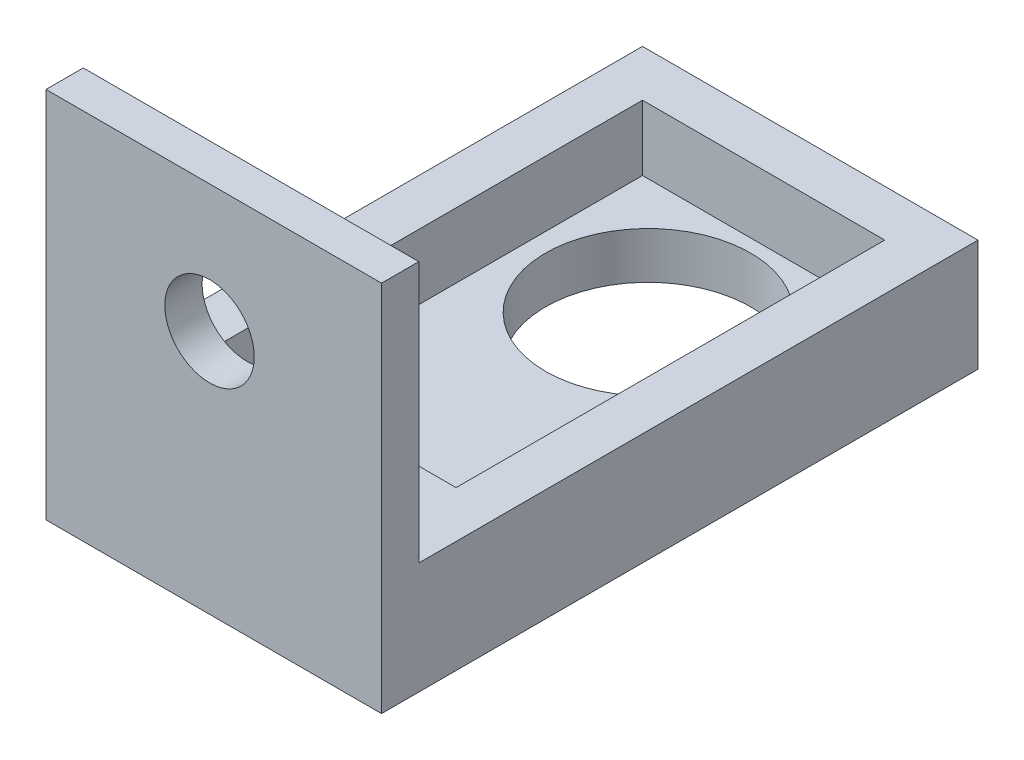
ISO-10303-21;
HEADER;
FILE_DESCRIPTION(('STEP AP214'),'2;1');
FILE_NAME('part.step','',(''),(''),'','','');
FILE_SCHEMA(('AUTOMOTIVE_DESIGN { 1 0 10303 214 1 1 1 1 }'));
ENDSEC;
DATA;
#1=APPLICATION_CONTEXT('core data for automotive mechanical design processes');
#2=APPLICATION_PROTOCOL_DEFINITION('international standard','automotive_design',2000,#1);
#3=PRODUCT_CONTEXT('',#1,'mechanical');
#4=PRODUCT('Part','Part','',(#3));
#5=PRODUCT_RELATED_PRODUCT_CATEGORY('part','',(#4));
#6=PRODUCT_DEFINITION_FORMATION('','',#4);
#7=PRODUCT_DEFINITION_CONTEXT('part definition',#1,'design');
#8=PRODUCT_DEFINITION('design','',#6,#7);
#9=PRODUCT_DEFINITION_SHAPE('','',#8);
#10=(LENGTH_UNIT() NAMED_UNIT(*) SI_UNIT(.MILLI.,.METRE.));
#11=(NAMED_UNIT(*) PLANE_ANGLE_UNIT() SI_UNIT($,.RADIAN.));
#12=(NAMED_UNIT(*) SI_UNIT($,.STERADIAN.) SOLID_ANGLE_UNIT());
#13=UNCERTAINTY_MEASURE_WITH_UNIT(LENGTH_MEASURE(1.E-05),#10,'distance_accuracy_value','');
#14=(GEOMETRIC_REPRESENTATION_CONTEXT(3) GLOBAL_UNCERTAINTY_ASSIGNED_CONTEXT((#13)) GLOBAL_UNIT_ASSIGNED_CONTEXT((#10,
#11,#12)) REPRESENTATION_CONTEXT('',''));
#15=CARTESIAN_POINT('',(0.,0.,0.));
#16=DIRECTION('',(0.,0.,1.));
#17=DIRECTION('',(1.,0.,0.));
#18=AXIS2_PLACEMENT_3D('',#15,#16,#17);
#19=CARTESIAN_POINT('',(0.,6.,0.));
#20=DIRECTION('',(0.,0.,-1.));
#21=DIRECTION('',(-1.,0.,0.));
#22=AXIS2_PLACEMENT_3D('',#19,#20,#21);
#23=PLANE('',#22);
#24=CARTESIAN_POINT('',(8.77418115402406,13.1552339504992,0.));
#25=DIRECTION('',(0.,0.,-1.));
#26=DIRECTION('',(-1.,0.,0.));
#27=AXIS2_PLACEMENT_3D('',#24,#25,#26);
#28=CIRCLE('',#27,2.4);
#29=CARTESIAN_POINT('',(6.37418115402406,13.1552339504992,0.));
#30=VERTEX_POINT('',#29);
#31=EDGE_CURVE('E134',#30,#30,#28,.T.);
#32=ORIENTED_EDGE('',*,*,#31,.T.);
#33=EDGE_LOOP('',(#32));
#34=FACE_BOUND('',#33,.T.);
#35=DIRECTION('',(1.,0.,0.));
#36=VECTOR('',#35,1.);
#37=CARTESIAN_POINT('',(0.,0.,0.));
#38=LINE('',#37,#36);
#39=CARTESIAN_POINT('',(0.,0.,0.));
#40=VERTEX_POINT('',#39);
#41=CARTESIAN_POINT('',(18.,0.,0.));
#42=VERTEX_POINT('',#41);
#43=EDGE_CURVE('E178',#40,#42,#38,.T.);
#44=ORIENTED_EDGE('',*,*,#43,.T.);
#45=DIRECTION('',(0.,-1.,0.));
#46=VECTOR('',#45,1.);
#47=CARTESIAN_POINT('',(18.,6.,0.));
#48=LINE('',#47,#46);
#49=CARTESIAN_POINT('',(18.,20.,0.));
#50=VERTEX_POINT('',#49);
#51=EDGE_CURVE('E11',#50,#42,#48,.T.);
#52=ORIENTED_EDGE('',*,*,#51,.F.);
#53=DIRECTION('',(1.,0.,0.));
#54=VECTOR('',#53,1.);
#55=CARTESIAN_POINT('',(0.,20.,0.));
#56=LINE('',#55,#54);
#57=CARTESIAN_POINT('',(0.,20.,0.));
#58=VERTEX_POINT('',#57);
#59=EDGE_CURVE('E124',#58,#50,#56,.T.);
#60=ORIENTED_EDGE('',*,*,#59,.F.);
#61=DIRECTION('',(0.,-1.,0.));
#62=VECTOR('',#61,1.);
#63=CARTESIAN_POINT('',(0.,6.,0.));
#64=LINE('',#63,#62);
#65=EDGE_CURVE('E109',#58,#40,#64,.T.);
#66=ORIENTED_EDGE('',*,*,#65,.T.);
#67=EDGE_LOOP('',(#44,#52,#60,#66));
#68=FACE_BOUND('',#67,.T.);
#69=ADVANCED_FACE('F33',(#34,#68),#23,.F.);
#70=CARTESIAN_POINT('',(18.,6.,0.));
#71=DIRECTION('',(-1.,0.,0.));
#72=DIRECTION('',(0.,0.,1.));
#73=AXIS2_PLACEMENT_3D('',#70,#71,#72);
#74=PLANE('',#73);
#75=DIRECTION('',(0.,0.,-1.));
#76=VECTOR('',#75,1.);
#77=CARTESIAN_POINT('',(18.,0.,0.));
#78=LINE('',#77,#76);
#79=CARTESIAN_POINT('',(18.,0.,-32.));
#80=VERTEX_POINT('',#79);
#81=EDGE_CURVE('E191',#42,#80,#78,.T.);
#82=ORIENTED_EDGE('',*,*,#81,.T.);
#83=DIRECTION('',(0.,-1.,0.));
#84=VECTOR('',#83,1.);
#85=CARTESIAN_POINT('',(18.,6.,-32.));
#86=LINE('',#85,#84);
#87=CARTESIAN_POINT('',(18.,6.,-32.));
#88=VERTEX_POINT('',#87);
#89=EDGE_CURVE('E40',#88,#80,#86,.T.);
#90=ORIENTED_EDGE('',*,*,#89,.F.);
#91=DIRECTION('',(0.,0.,-1.));
#92=VECTOR('',#91,1.);
#93=CARTESIAN_POINT('',(18.,6.,0.));
#94=LINE('',#93,#92);
#95=CARTESIAN_POINT('',(18.,6.,-2.));
#96=VERTEX_POINT('',#95);
#97=EDGE_CURVE('E184',#96,#88,#94,.T.);
#98=ORIENTED_EDGE('',*,*,#97,.F.);
#99=DIRECTION('',(0.,-1.,0.));
#100=VECTOR('',#99,1.);
#101=CARTESIAN_POINT('',(18.,20.,-2.));
#102=LINE('',#101,#100);
#103=CARTESIAN_POINT('',(18.,20.,-2.));
#104=VERTEX_POINT('',#103);
#105=EDGE_CURVE('E144',#104,#96,#102,.T.);
#106=ORIENTED_EDGE('',*,*,#105,.F.);
#107=DIRECTION('',(0.,0.,-1.));
#108=VECTOR('',#107,1.);
#109=CARTESIAN_POINT('',(18.,20.,-2.));
#110=LINE('',#109,#108);
#111=EDGE_CURVE('E127',#50,#104,#110,.T.);
#112=ORIENTED_EDGE('',*,*,#111,.F.);
#113=ORIENTED_EDGE('',*,*,#51,.T.);
#114=EDGE_LOOP('',(#82,#90,#98,#106,#112,#113));
#115=FACE_BOUND('',#114,.T.);
#116=ADVANCED_FACE('F205',(#115),#74,.F.);
#117=CARTESIAN_POINT('',(0.,6.,-32.));
#118=DIRECTION('',(0.,0.,-1.));
#119=DIRECTION('',(-1.,0.,0.));
#120=AXIS2_PLACEMENT_3D('',#117,#118,#119);
#121=PLANE('',#120);
#122=DIRECTION('',(1.,0.,0.));
#123=VECTOR('',#122,1.);
#124=CARTESIAN_POINT('',(0.,0.,-32.));
#125=LINE('',#124,#123);
#126=CARTESIAN_POINT('',(0.,0.,-32.));
#127=VERTEX_POINT('',#126);
#128=EDGE_CURVE('E194',#127,#80,#125,.T.);
#129=ORIENTED_EDGE('',*,*,#128,.F.);
#130=DIRECTION('',(0.,-1.,0.));
#131=VECTOR('',#130,1.);
#132=CARTESIAN_POINT('',(0.,6.,-32.));
#133=LINE('',#132,#131);
#134=CARTESIAN_POINT('',(0.,6.,-32.));
#135=VERTEX_POINT('',#134);
#136=EDGE_CURVE('E120',#135,#127,#133,.T.);
#137=ORIENTED_EDGE('',*,*,#136,.F.);
#138=DIRECTION('',(1.,0.,0.));
#139=VECTOR('',#138,1.);
#140=CARTESIAN_POINT('',(0.,6.,-32.));
#141=LINE('',#140,#139);
#142=EDGE_CURVE('E186',#135,#88,#141,.T.);
#143=ORIENTED_EDGE('',*,*,#142,.T.);
#144=ORIENTED_EDGE('',*,*,#89,.T.);
#145=EDGE_LOOP('',(#129,#137,#143,#144));
#146=FACE_BOUND('',#145,.T.);
#147=ADVANCED_FACE('F201',(#146),#121,.T.);
#148=CARTESIAN_POINT('',(0.,6.,0.));
#149=DIRECTION('',(-1.,0.,0.));
#150=DIRECTION('',(0.,0.,1.));
#151=AXIS2_PLACEMENT_3D('',#148,#149,#150);
#152=PLANE('',#151);
#153=DIRECTION('',(0.,0.,-1.));
#154=VECTOR('',#153,1.);
#155=CARTESIAN_POINT('',(0.,0.,0.));
#156=LINE('',#155,#154);
#157=EDGE_CURVE('E116',#40,#127,#156,.T.);
#158=ORIENTED_EDGE('',*,*,#157,.F.);
#159=ORIENTED_EDGE('',*,*,#65,.F.);
#160=DIRECTION('',(0.,0.,1.));
#161=VECTOR('',#160,1.);
#162=CARTESIAN_POINT('',(0.,20.,-2.));
#163=LINE('',#162,#161);
#164=CARTESIAN_POINT('',(0.,20.,-2.));
#165=VERTEX_POINT('',#164);
#166=EDGE_CURVE('E114',#165,#58,#163,.T.);
#167=ORIENTED_EDGE('',*,*,#166,.F.);
#168=DIRECTION('',(0.,-1.,0.));
#169=VECTOR('',#168,1.);
#170=CARTESIAN_POINT('',(0.,20.,-2.));
#171=LINE('',#170,#169);
#172=CARTESIAN_POINT('',(0.,6.,-2.));
#173=VERTEX_POINT('',#172);
#174=EDGE_CURVE('E141',#165,#173,#171,.T.);
#175=ORIENTED_EDGE('',*,*,#174,.T.);
#176=DIRECTION('',(0.,0.,-1.));
#177=VECTOR('',#176,1.);
#178=CARTESIAN_POINT('',(0.,6.,0.));
#179=LINE('',#178,#177);
#180=EDGE_CURVE('E121',#173,#135,#179,.T.);
#181=ORIENTED_EDGE('',*,*,#180,.T.);
#182=ORIENTED_EDGE('',*,*,#136,.T.);
#183=EDGE_LOOP('',(#158,#159,#167,#175,#181,#182));
#184=FACE_BOUND('',#183,.T.);
#185=ADVANCED_FACE('F111',(#184),#152,.T.);
#186=CARTESIAN_POINT('',(0.,6.,0.));
#187=DIRECTION('',(0.,1.,0.));
#188=DIRECTION('',(0.,0.,1.));
#189=AXIS2_PLACEMENT_3D('',#186,#187,#188);
#190=PLANE('',#189);
#191=DIRECTION('',(-1.,0.,0.));
#192=VECTOR('',#191,1.);
#193=CARTESIAN_POINT('',(0.,6.,-2.));
#194=LINE('',#193,#192);
#195=EDGE_CURVE('E47',#96,#173,#194,.T.);
#196=ORIENTED_EDGE('',*,*,#195,.F.);
#197=ORIENTED_EDGE('',*,*,#97,.T.);
#198=ORIENTED_EDGE('',*,*,#142,.F.);
#199=ORIENTED_EDGE('',*,*,#180,.F.);
#200=EDGE_LOOP('',(#196,#197,#198,#199));
#201=FACE_BOUND('',#200,.T.);
#202=DIRECTION('',(0.,0.,1.));
#203=VECTOR('',#202,1.);
#204=CARTESIAN_POINT('',(2.5,6.,-29.5));
#205=LINE('',#204,#203);
#206=CARTESIAN_POINT('',(2.5,6.,-29.5));
#207=VERTEX_POINT('',#206);
#208=CARTESIAN_POINT('',(2.5,6.,-6.5));
#209=VERTEX_POINT('',#208);
#210=EDGE_CURVE('E55',#207,#209,#205,.T.);
#211=ORIENTED_EDGE('',*,*,#210,.F.);
#212=DIRECTION('',(-1.,0.,0.));
#213=VECTOR('',#212,1.);
#214=CARTESIAN_POINT('',(2.5,6.,-29.5));
#215=LINE('',#214,#213);
#216=CARTESIAN_POINT('',(15.5,6.,-29.5));
#217=VERTEX_POINT('',#216);
#218=EDGE_CURVE('E157',#217,#207,#215,.T.);
#219=ORIENTED_EDGE('',*,*,#218,.F.);
#220=DIRECTION('',(0.,0.,-1.));
#221=VECTOR('',#220,1.);
#222=CARTESIAN_POINT('',(15.5,6.,-29.5));
#223=LINE('',#222,#221);
#224=CARTESIAN_POINT('',(15.5,6.,-6.5));
#225=VERTEX_POINT('',#224);
#226=EDGE_CURVE('E171',#225,#217,#223,.T.);
#227=ORIENTED_EDGE('',*,*,#226,.F.);
#228=DIRECTION('',(1.,0.,0.));
#229=VECTOR('',#228,1.);
#230=CARTESIAN_POINT('',(2.5,6.,-6.5));
#231=LINE('',#230,#229);
#232=EDGE_CURVE('E168',#209,#225,#231,.T.);
#233=ORIENTED_EDGE('',*,*,#232,.F.);
#234=EDGE_LOOP('',(#211,#219,#227,#233));
#235=FACE_BOUND('',#234,.T.);
#236=ADVANCED_FACE('F210',(#201,#235),#190,.T.);
#237=CARTESIAN_POINT('',(0.,0.,0.));
#238=DIRECTION('',(0.,1.,0.));
#239=DIRECTION('',(0.,0.,1.));
#240=AXIS2_PLACEMENT_3D('',#237,#238,#239);
#241=PLANE('',#240);
#242=CARTESIAN_POINT('',(9.00082015487732,0.,-23.3));
#243=DIRECTION('',(0.,1.,0.));
#244=DIRECTION('',(0.,0.,1.));
#245=AXIS2_PLACEMENT_3D('',#242,#243,#244);
#246=CIRCLE('',#245,5.5);
#247=CARTESIAN_POINT('',(9.00082015487732,0.,-17.8));
#248=VERTEX_POINT('',#247);
#249=EDGE_CURVE('E148',#248,#248,#246,.T.);
#250=ORIENTED_EDGE('',*,*,#249,.T.);
#251=EDGE_LOOP('',(#250));
#252=FACE_BOUND('',#251,.T.);
#253=ORIENTED_EDGE('',*,*,#43,.F.);
#254=ORIENTED_EDGE('',*,*,#157,.T.);
#255=ORIENTED_EDGE('',*,*,#128,.T.);
#256=ORIENTED_EDGE('',*,*,#81,.F.);
#257=EDGE_LOOP('',(#253,#254,#255,#256));
#258=FACE_BOUND('',#257,.T.);
#259=ADVANCED_FACE('F207',(#252,#258),#241,.F.);
#260=CARTESIAN_POINT('',(2.5,2.5,-29.5));
#261=DIRECTION('',(-1.,0.,0.));
#262=DIRECTION('',(0.,0.,1.));
#263=AXIS2_PLACEMENT_3D('',#260,#261,#262);
#264=PLANE('',#263);
#265=ORIENTED_EDGE('',*,*,#210,.T.);
#266=DIRECTION('',(0.,1.,0.));
#267=VECTOR('',#266,1.);
#268=CARTESIAN_POINT('',(2.5,2.5,-6.5));
#269=LINE('',#268,#267);
#270=CARTESIAN_POINT('',(2.5,2.5,-6.5));
#271=VERTEX_POINT('',#270);
#272=EDGE_CURVE('E166',#271,#209,#269,.T.);
#273=ORIENTED_EDGE('',*,*,#272,.F.);
#274=DIRECTION('',(0.,0.,1.));
#275=VECTOR('',#274,1.);
#276=CARTESIAN_POINT('',(2.5,2.5,-29.5));
#277=LINE('',#276,#275);
#278=CARTESIAN_POINT('',(2.5,2.5,-29.5));
#279=VERTEX_POINT('',#278);
#280=EDGE_CURVE('E153',#279,#271,#277,.T.);
#281=ORIENTED_EDGE('',*,*,#280,.F.);
#282=DIRECTION('',(0.,1.,0.));
#283=VECTOR('',#282,1.);
#284=CARTESIAN_POINT('',(2.5,2.5,-29.5));
#285=LINE('',#284,#283);
#286=EDGE_CURVE('E176',#279,#207,#285,.T.);
#287=ORIENTED_EDGE('',*,*,#286,.T.);
#288=EDGE_LOOP('',(#265,#273,#281,#287));
#289=FACE_BOUND('',#288,.T.);
#290=ADVANCED_FACE('F209',(#289),#264,.F.);
#291=CARTESIAN_POINT('',(2.5,2.5,-29.5));
#292=DIRECTION('',(0.,0.,-1.));
#293=DIRECTION('',(-1.,0.,0.));
#294=AXIS2_PLACEMENT_3D('',#291,#292,#293);
#295=PLANE('',#294);
#296=ORIENTED_EDGE('',*,*,#218,.T.);
#297=ORIENTED_EDGE('',*,*,#286,.F.);
#298=DIRECTION('',(-1.,0.,0.));
#299=VECTOR('',#298,1.);
#300=CARTESIAN_POINT('',(2.5,2.5,-29.5));
#301=LINE('',#300,#299);
#302=CARTESIAN_POINT('',(15.5,2.5,-29.5));
#303=VERTEX_POINT('',#302);
#304=EDGE_CURVE('E163',#303,#279,#301,.T.);
#305=ORIENTED_EDGE('',*,*,#304,.F.);
#306=DIRECTION('',(0.,1.,0.));
#307=VECTOR('',#306,1.);
#308=CARTESIAN_POINT('',(15.5,2.5,-29.5));
#309=LINE('',#308,#307);
#310=EDGE_CURVE('E179',#303,#217,#309,.T.);
#311=ORIENTED_EDGE('',*,*,#310,.T.);
#312=EDGE_LOOP('',(#296,#297,#305,#311));
#313=FACE_BOUND('',#312,.T.);
#314=ADVANCED_FACE('F217',(#313),#295,.F.);
#315=CARTESIAN_POINT('',(15.5,2.5,-29.5));
#316=DIRECTION('',(1.,0.,0.));
#317=DIRECTION('',(0.,0.,-1.));
#318=AXIS2_PLACEMENT_3D('',#315,#316,#317);
#319=PLANE('',#318);
#320=ORIENTED_EDGE('',*,*,#226,.T.);
#321=ORIENTED_EDGE('',*,*,#310,.F.);
#322=DIRECTION('',(0.,0.,-1.));
#323=VECTOR('',#322,1.);
#324=CARTESIAN_POINT('',(15.5,2.5,-29.5));
#325=LINE('',#324,#323);
#326=CARTESIAN_POINT('',(15.5,2.5,-6.5));
#327=VERTEX_POINT('',#326);
#328=EDGE_CURVE('E160',#327,#303,#325,.T.);
#329=ORIENTED_EDGE('',*,*,#328,.F.);
#330=DIRECTION('',(0.,1.,0.));
#331=VECTOR('',#330,1.);
#332=CARTESIAN_POINT('',(15.5,2.5,-6.5));
#333=LINE('',#332,#331);
#334=EDGE_CURVE('E181',#327,#225,#333,.T.);
#335=ORIENTED_EDGE('',*,*,#334,.T.);
#336=EDGE_LOOP('',(#320,#321,#329,#335));
#337=FACE_BOUND('',#336,.T.);
#338=ADVANCED_FACE('F254',(#337),#319,.F.);
#339=CARTESIAN_POINT('',(2.5,2.5,-6.5));
#340=DIRECTION('',(0.,0.,1.));
#341=DIRECTION('',(1.,0.,0.));
#342=AXIS2_PLACEMENT_3D('',#339,#340,#341);
#343=PLANE('',#342);
#344=ORIENTED_EDGE('',*,*,#232,.T.);
#345=ORIENTED_EDGE('',*,*,#334,.F.);
#346=DIRECTION('',(1.,0.,0.));
#347=VECTOR('',#346,1.);
#348=CARTESIAN_POINT('',(2.5,2.5,-6.5));
#349=LINE('',#348,#347);
#350=EDGE_CURVE('E156',#271,#327,#349,.T.);
#351=ORIENTED_EDGE('',*,*,#350,.F.);
#352=ORIENTED_EDGE('',*,*,#272,.T.);
#353=EDGE_LOOP('',(#344,#345,#351,#352));
#354=FACE_BOUND('',#353,.T.);
#355=ADVANCED_FACE('F245',(#354),#343,.F.);
#356=CARTESIAN_POINT('',(0.,2.5,0.));
#357=DIRECTION('',(0.,1.,0.));
#358=DIRECTION('',(0.,0.,1.));
#359=AXIS2_PLACEMENT_3D('',#356,#357,#358);
#360=PLANE('',#359);
#361=CARTESIAN_POINT('',(9.00082015487732,2.5,-23.3));
#362=DIRECTION('',(0.,1.,0.));
#363=DIRECTION('',(0.,0.,1.));
#364=AXIS2_PLACEMENT_3D('',#361,#362,#363);
#365=CIRCLE('',#364,5.5);
#366=CARTESIAN_POINT('',(9.00082015487732,2.5,-17.8));
#367=VERTEX_POINT('',#366);
#368=EDGE_CURVE('E147',#367,#367,#365,.T.);
#369=ORIENTED_EDGE('',*,*,#368,.F.);
#370=EDGE_LOOP('',(#369));
#371=FACE_BOUND('',#370,.T.);
#372=ORIENTED_EDGE('',*,*,#280,.T.);
#373=ORIENTED_EDGE('',*,*,#350,.T.);
#374=ORIENTED_EDGE('',*,*,#328,.T.);
#375=ORIENTED_EDGE('',*,*,#304,.T.);
#376=EDGE_LOOP('',(#372,#373,#374,#375));
#377=FACE_BOUND('',#376,.T.);
#378=ADVANCED_FACE('F251',(#371,#377),#360,.T.);
#379=CARTESIAN_POINT('',(9.00082015487732,0.,-23.3));
#380=DIRECTION('',(0.,1.,0.));
#381=DIRECTION('',(0.,0.,1.));
#382=AXIS2_PLACEMENT_3D('',#379,#380,#381);
#383=CYLINDRICAL_SURFACE('',#382,5.5);
#384=ORIENTED_EDGE('',*,*,#249,.F.);
#385=EDGE_LOOP('',(#384));
#386=FACE_BOUND('',#385,.T.);
#387=ORIENTED_EDGE('',*,*,#368,.T.);
#388=EDGE_LOOP('',(#387));
#389=FACE_BOUND('',#388,.T.);
#390=ADVANCED_FACE('F237',(#386,#389),#383,.F.);
#391=CARTESIAN_POINT('',(0.,20.,-2.));
#392=DIRECTION('',(0.,0.,1.));
#393=DIRECTION('',(1.,0.,0.));
#394=AXIS2_PLACEMENT_3D('',#391,#392,#393);
#395=PLANE('',#394);
#396=CARTESIAN_POINT('',(8.77418115402406,13.1552339504992,-2.));
#397=DIRECTION('',(0.,0.,-1.));
#398=DIRECTION('',(-1.,0.,0.));
#399=AXIS2_PLACEMENT_3D('',#396,#397,#398);
#400=CIRCLE('',#399,2.4);
#401=CARTESIAN_POINT('',(6.37418115402406,13.1552339504992,-2.));
#402=VERTEX_POINT('',#401);
#403=EDGE_CURVE('E137',#402,#402,#400,.T.);
#404=ORIENTED_EDGE('',*,*,#403,.F.);
#405=EDGE_LOOP('',(#404));
#406=FACE_BOUND('',#405,.T.);
#407=ORIENTED_EDGE('',*,*,#195,.T.);
#408=ORIENTED_EDGE('',*,*,#174,.F.);
#409=DIRECTION('',(-1.,0.,0.));
#410=VECTOR('',#409,1.);
#411=CARTESIAN_POINT('',(0.,20.,-2.));
#412=LINE('',#411,#410);
#413=EDGE_CURVE('E131',#104,#165,#412,.T.);
#414=ORIENTED_EDGE('',*,*,#413,.F.);
#415=ORIENTED_EDGE('',*,*,#105,.T.);
#416=EDGE_LOOP('',(#407,#408,#414,#415));
#417=FACE_BOUND('',#416,.T.);
#418=ADVANCED_FACE('F234',(#406,#417),#395,.F.);
#419=CARTESIAN_POINT('',(0.,20.,0.));
#420=DIRECTION('',(0.,1.,0.));
#421=DIRECTION('',(0.,0.,1.));
#422=AXIS2_PLACEMENT_3D('',#419,#420,#421);
#423=PLANE('',#422);
#424=ORIENTED_EDGE('',*,*,#166,.T.);
#425=ORIENTED_EDGE('',*,*,#59,.T.);
#426=ORIENTED_EDGE('',*,*,#111,.T.);
#427=ORIENTED_EDGE('',*,*,#413,.T.);
#428=EDGE_LOOP('',(#424,#425,#426,#427));
#429=FACE_BOUND('',#428,.T.);
#430=ADVANCED_FACE('F129',(#429),#423,.T.);
#431=CARTESIAN_POINT('',(8.77418115402406,13.1552339504992,0.));
#432=DIRECTION('',(0.,0.,-1.));
#433=DIRECTION('',(-1.,0.,0.));
#434=AXIS2_PLACEMENT_3D('',#431,#432,#433);
#435=CYLINDRICAL_SURFACE('',#434,2.4);
#436=ORIENTED_EDGE('',*,*,#31,.F.);
#437=EDGE_LOOP('',(#436));
#438=FACE_BOUND('',#437,.T.);
#439=ORIENTED_EDGE('',*,*,#403,.T.);
#440=EDGE_LOOP('',(#439));
#441=FACE_BOUND('',#440,.T.);
#442=ADVANCED_FACE('F232',(#438,#441),#435,.F.);
#443=CLOSED_SHELL('',(#69,#116,#147,#185,#236,#259,#290,#314,#338,#355,#378,#390,#418,#430,#442));
#444=MANIFOLD_SOLID_BREP('B2',#443);
#445=ADVANCED_BREP_SHAPE_REPRESENTATION('',(#18,#444),#14);
#446=SHAPE_DEFINITION_REPRESENTATION(#9,#445);
ENDSEC;
END-ISO-10303-21;
